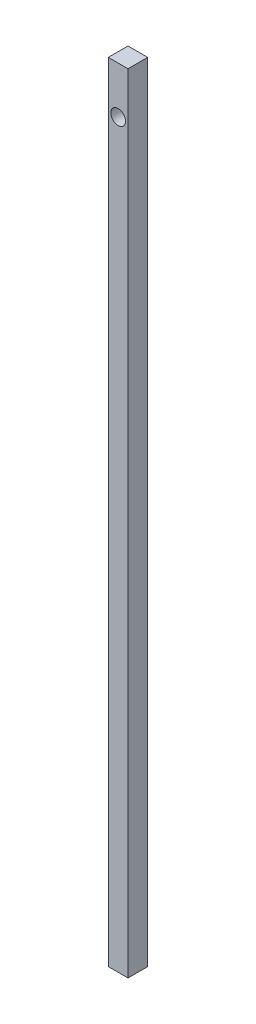
ISO-10303-21;
HEADER;
FILE_DESCRIPTION(('STEP AP214'),'2;1');
FILE_NAME('part.step','',(''),(''),'','','');
FILE_SCHEMA(('AUTOMOTIVE_DESIGN { 1 0 10303 214 1 1 1 1 }'));
ENDSEC;
DATA;
#1=APPLICATION_CONTEXT('core data for automotive mechanical design processes');
#2=APPLICATION_PROTOCOL_DEFINITION('international standard','automotive_design',2000,#1);
#3=PRODUCT_CONTEXT('',#1,'mechanical');
#4=PRODUCT('Part','Part','',(#3));
#5=PRODUCT_RELATED_PRODUCT_CATEGORY('part','',(#4));
#6=PRODUCT_DEFINITION_FORMATION('','',#4);
#7=PRODUCT_DEFINITION_CONTEXT('part definition',#1,'design');
#8=PRODUCT_DEFINITION('design','',#6,#7);
#9=PRODUCT_DEFINITION_SHAPE('','',#8);
#10=(LENGTH_UNIT() NAMED_UNIT(*) SI_UNIT(.MILLI.,.METRE.));
#11=(NAMED_UNIT(*) PLANE_ANGLE_UNIT() SI_UNIT($,.RADIAN.));
#12=(NAMED_UNIT(*) SI_UNIT($,.STERADIAN.) SOLID_ANGLE_UNIT());
#13=UNCERTAINTY_MEASURE_WITH_UNIT(LENGTH_MEASURE(1.E-05),#10,'distance_accuracy_value','');
#14=(GEOMETRIC_REPRESENTATION_CONTEXT(3) GLOBAL_UNCERTAINTY_ASSIGNED_CONTEXT((#13)) GLOBAL_UNIT_ASSIGNED_CONTEXT((#10,
#11,#12)) REPRESENTATION_CONTEXT('',''));
#15=CARTESIAN_POINT('',(0.,0.,0.));
#16=DIRECTION('',(0.,0.,1.));
#17=DIRECTION('',(1.,0.,0.));
#18=AXIS2_PLACEMENT_3D('',#15,#16,#17);
#19=CARTESIAN_POINT('',(25.4,2032.,25.4));
#20=DIRECTION('',(-1.,0.,0.));
#21=DIRECTION('',(0.,0.,1.));
#22=AXIS2_PLACEMENT_3D('',#19,#20,#21);
#23=PLANE('',#22);
#24=DIRECTION('',(0.,0.,-1.));
#25=VECTOR('',#24,1.);
#26=CARTESIAN_POINT('',(25.4,0.,25.4));
#27=LINE('',#26,#25);
#28=CARTESIAN_POINT('',(25.4,0.,25.4));
#29=VERTEX_POINT('',#28);
#30=CARTESIAN_POINT('',(25.4,0.,-25.4));
#31=VERTEX_POINT('',#30);
#32=EDGE_CURVE('E113',#29,#31,#27,.T.);
#33=ORIENTED_EDGE('',*,*,#32,.T.);
#34=DIRECTION('',(0.,-1.,0.));
#35=VECTOR('',#34,1.);
#36=CARTESIAN_POINT('',(25.4,2032.,-25.4));
#37=LINE('',#36,#35);
#38=CARTESIAN_POINT('',(25.4,2032.,-25.4));
#39=VERTEX_POINT('',#38);
#40=EDGE_CURVE('E11',#39,#31,#37,.T.);
#41=ORIENTED_EDGE('',*,*,#40,.F.);
#42=DIRECTION('',(0.,0.,-1.));
#43=VECTOR('',#42,1.);
#44=CARTESIAN_POINT('',(25.4,2032.,25.4));
#45=LINE('',#44,#43);
#46=CARTESIAN_POINT('',(25.4,2032.,25.4));
#47=VERTEX_POINT('',#46);
#48=EDGE_CURVE('E96',#47,#39,#45,.T.);
#49=ORIENTED_EDGE('',*,*,#48,.F.);
#50=DIRECTION('',(0.,-1.,0.));
#51=VECTOR('',#50,1.);
#52=CARTESIAN_POINT('',(25.4,2032.,25.4));
#53=LINE('',#52,#51);
#54=EDGE_CURVE('E109',#47,#29,#53,.T.);
#55=ORIENTED_EDGE('',*,*,#54,.T.);
#56=EDGE_LOOP('',(#33,#41,#49,#55));
#57=FACE_BOUND('',#56,.T.);
#58=ADVANCED_FACE('F41',(#57),#23,.F.);
#59=CARTESIAN_POINT('',(-25.4,2032.,-25.4));
#60=DIRECTION('',(0.,0.,1.));
#61=DIRECTION('',(1.,0.,0.));
#62=AXIS2_PLACEMENT_3D('',#59,#60,#61);
#63=PLANE('',#62);
#64=CARTESIAN_POINT('',(0.,1911.35,-25.4));
#65=DIRECTION('',(0.,0.,1.));
#66=DIRECTION('',(1.,0.,0.));
#67=AXIS2_PLACEMENT_3D('',#64,#65,#66);
#68=CIRCLE('',#67,19.05);
#69=CARTESIAN_POINT('',(19.05,1911.35,-25.4));
#70=VERTEX_POINT('',#69);
#71=EDGE_CURVE('E116',#70,#70,#68,.T.);
#72=ORIENTED_EDGE('',*,*,#71,.T.);
#73=EDGE_LOOP('',(#72));
#74=FACE_BOUND('',#73,.T.);
#75=DIRECTION('',(-1.,0.,0.));
#76=VECTOR('',#75,1.);
#77=CARTESIAN_POINT('',(-25.4,0.,-25.4));
#78=LINE('',#77,#76);
#79=CARTESIAN_POINT('',(-25.4,0.,-25.4));
#80=VERTEX_POINT('',#79);
#81=EDGE_CURVE('E101',#31,#80,#78,.T.);
#82=ORIENTED_EDGE('',*,*,#81,.T.);
#83=DIRECTION('',(0.,-1.,0.));
#84=VECTOR('',#83,1.);
#85=CARTESIAN_POINT('',(-25.4,2032.,-25.4));
#86=LINE('',#85,#84);
#87=CARTESIAN_POINT('',(-25.4,2032.,-25.4));
#88=VERTEX_POINT('',#87);
#89=EDGE_CURVE('E50',#88,#80,#86,.T.);
#90=ORIENTED_EDGE('',*,*,#89,.F.);
#91=DIRECTION('',(-1.,0.,0.));
#92=VECTOR('',#91,1.);
#93=CARTESIAN_POINT('',(-25.4,2032.,-25.4));
#94=LINE('',#93,#92);
#95=EDGE_CURVE('E91',#39,#88,#94,.T.);
#96=ORIENTED_EDGE('',*,*,#95,.F.);
#97=ORIENTED_EDGE('',*,*,#40,.T.);
#98=EDGE_LOOP('',(#82,#90,#96,#97));
#99=FACE_BOUND('',#98,.T.);
#100=ADVANCED_FACE('F100',(#74,#99),#63,.F.);
#101=CARTESIAN_POINT('',(-25.4,2032.,25.4));
#102=DIRECTION('',(1.,0.,0.));
#103=DIRECTION('',(0.,0.,-1.));
#104=AXIS2_PLACEMENT_3D('',#101,#102,#103);
#105=PLANE('',#104);
#106=DIRECTION('',(0.,0.,1.));
#107=VECTOR('',#106,1.);
#108=CARTESIAN_POINT('',(-25.4,0.,25.4));
#109=LINE('',#108,#107);
#110=CARTESIAN_POINT('',(-25.4,0.,25.4));
#111=VERTEX_POINT('',#110);
#112=EDGE_CURVE('E77',#80,#111,#109,.T.);
#113=ORIENTED_EDGE('',*,*,#112,.T.);
#114=DIRECTION('',(0.,-1.,0.));
#115=VECTOR('',#114,1.);
#116=CARTESIAN_POINT('',(-25.4,2032.,25.4));
#117=LINE('',#116,#115);
#118=CARTESIAN_POINT('',(-25.4,2032.,25.4));
#119=VERTEX_POINT('',#118);
#120=EDGE_CURVE('E103',#119,#111,#117,.T.);
#121=ORIENTED_EDGE('',*,*,#120,.F.);
#122=DIRECTION('',(0.,0.,1.));
#123=VECTOR('',#122,1.);
#124=CARTESIAN_POINT('',(-25.4,2032.,25.4));
#125=LINE('',#124,#123);
#126=EDGE_CURVE('E94',#88,#119,#125,.T.);
#127=ORIENTED_EDGE('',*,*,#126,.F.);
#128=ORIENTED_EDGE('',*,*,#89,.T.);
#129=EDGE_LOOP('',(#113,#121,#127,#128));
#130=FACE_BOUND('',#129,.T.);
#131=ADVANCED_FACE('F104',(#130),#105,.F.);
#132=CARTESIAN_POINT('',(-25.4,2032.,25.4));
#133=DIRECTION('',(0.,0.,-1.));
#134=DIRECTION('',(-1.,0.,0.));
#135=AXIS2_PLACEMENT_3D('',#132,#133,#134);
#136=PLANE('',#135);
#137=CARTESIAN_POINT('',(0.,1911.35,25.4));
#138=DIRECTION('',(0.,0.,1.));
#139=DIRECTION('',(1.,0.,0.));
#140=AXIS2_PLACEMENT_3D('',#137,#138,#139);
#141=CIRCLE('',#140,19.05);
#142=CARTESIAN_POINT('',(19.05,1911.35,25.4));
#143=VERTEX_POINT('',#142);
#144=EDGE_CURVE('E130',#143,#143,#141,.T.);
#145=ORIENTED_EDGE('',*,*,#144,.F.);
#146=EDGE_LOOP('',(#145));
#147=FACE_BOUND('',#146,.T.);
#148=DIRECTION('',(1.,0.,0.));
#149=VECTOR('',#148,1.);
#150=CARTESIAN_POINT('',(-25.4,0.,25.4));
#151=LINE('',#150,#149);
#152=EDGE_CURVE('E83',#111,#29,#151,.T.);
#153=ORIENTED_EDGE('',*,*,#152,.T.);
#154=ORIENTED_EDGE('',*,*,#54,.F.);
#155=DIRECTION('',(1.,0.,0.));
#156=VECTOR('',#155,1.);
#157=CARTESIAN_POINT('',(-25.4,2032.,25.4));
#158=LINE('',#157,#156);
#159=EDGE_CURVE('E60',#119,#47,#158,.T.);
#160=ORIENTED_EDGE('',*,*,#159,.F.);
#161=ORIENTED_EDGE('',*,*,#120,.T.);
#162=EDGE_LOOP('',(#153,#154,#160,#161));
#163=FACE_BOUND('',#162,.T.);
#164=ADVANCED_FACE('F124',(#147,#163),#136,.F.);
#165=CARTESIAN_POINT('',(0.,2032.,0.));
#166=DIRECTION('',(0.,-1.,0.));
#167=DIRECTION('',(0.,0.,-1.));
#168=AXIS2_PLACEMENT_3D('',#165,#166,#167);
#169=PLANE('',#168);
#170=ORIENTED_EDGE('',*,*,#48,.T.);
#171=ORIENTED_EDGE('',*,*,#95,.T.);
#172=ORIENTED_EDGE('',*,*,#126,.T.);
#173=ORIENTED_EDGE('',*,*,#159,.T.);
#174=EDGE_LOOP('',(#170,#171,#172,#173));
#175=FACE_BOUND('',#174,.T.);
#176=ADVANCED_FACE('F92',(#175),#169,.F.);
#177=CARTESIAN_POINT('',(0.,0.,0.));
#178=DIRECTION('',(0.,-1.,0.));
#179=DIRECTION('',(0.,0.,-1.));
#180=AXIS2_PLACEMENT_3D('',#177,#178,#179);
#181=PLANE('',#180);
#182=ORIENTED_EDGE('',*,*,#32,.F.);
#183=ORIENTED_EDGE('',*,*,#152,.F.);
#184=ORIENTED_EDGE('',*,*,#112,.F.);
#185=ORIENTED_EDGE('',*,*,#81,.F.);
#186=EDGE_LOOP('',(#182,#183,#184,#185));
#187=FACE_BOUND('',#186,.T.);
#188=ADVANCED_FACE('F127',(#187),#181,.T.);
#189=CARTESIAN_POINT('',(0.,1911.35,-25.4));
#190=DIRECTION('',(0.,0.,1.));
#191=DIRECTION('',(1.,0.,0.));
#192=AXIS2_PLACEMENT_3D('',#189,#190,#191);
#193=CYLINDRICAL_SURFACE('',#192,19.05);
#194=ORIENTED_EDGE('',*,*,#71,.F.);
#195=EDGE_LOOP('',(#194));
#196=FACE_BOUND('',#195,.T.);
#197=ORIENTED_EDGE('',*,*,#144,.T.);
#198=EDGE_LOOP('',(#197));
#199=FACE_BOUND('',#198,.T.);
#200=ADVANCED_FACE('F138',(#196,#199),#193,.F.);
#201=CLOSED_SHELL('',(#58,#100,#131,#164,#176,#188,#200));
#202=MANIFOLD_SOLID_BREP('B2',#201);
#203=ADVANCED_BREP_SHAPE_REPRESENTATION('',(#18,#202),#14);
#204=SHAPE_DEFINITION_REPRESENTATION(#9,#203);
ENDSEC;
END-ISO-10303-21;
